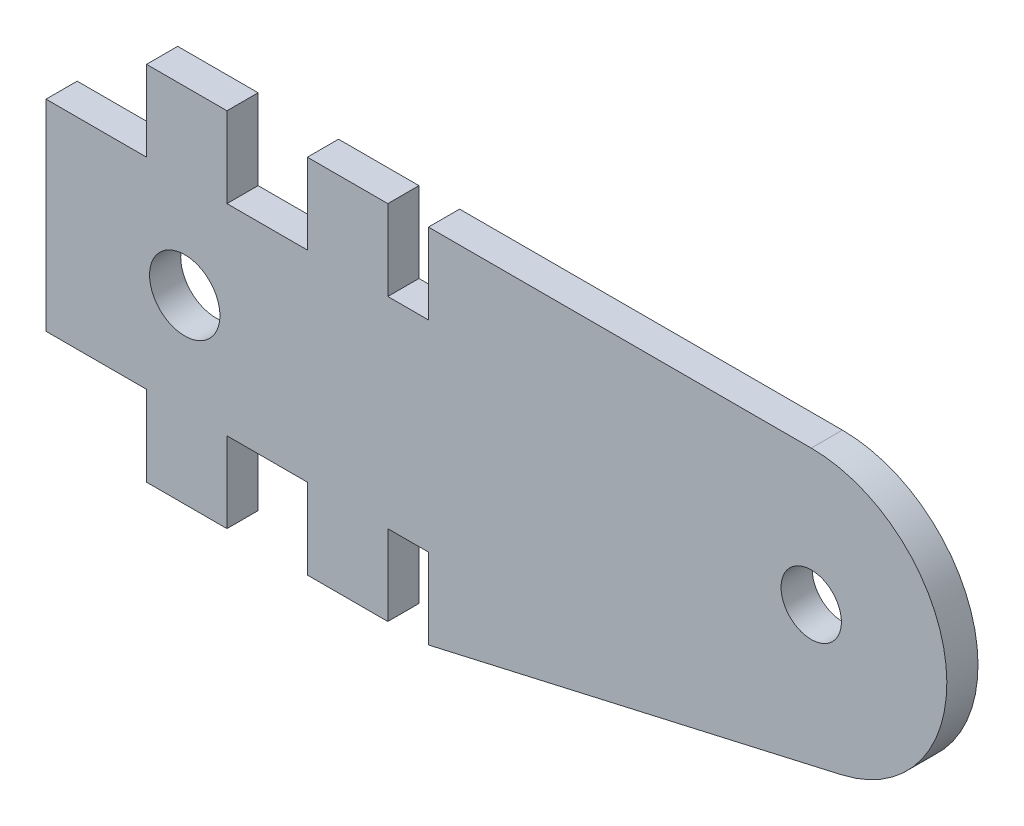
ISO-10303-21;
HEADER;
FILE_DESCRIPTION(('STEP AP214'),'2;1');
FILE_NAME('part.step','',(''),(''),'','','');
FILE_SCHEMA(('AUTOMOTIVE_DESIGN { 1 0 10303 214 1 1 1 1 }'));
ENDSEC;
DATA;
#1=APPLICATION_CONTEXT('core data for automotive mechanical design processes');
#2=APPLICATION_PROTOCOL_DEFINITION('international standard','automotive_design',2000,#1);
#3=PRODUCT_CONTEXT('',#1,'mechanical');
#4=PRODUCT('Part','Part','',(#3));
#5=PRODUCT_RELATED_PRODUCT_CATEGORY('part','',(#4));
#6=PRODUCT_DEFINITION_FORMATION('','',#4);
#7=PRODUCT_DEFINITION_CONTEXT('part definition',#1,'design');
#8=PRODUCT_DEFINITION('design','',#6,#7);
#9=PRODUCT_DEFINITION_SHAPE('','',#8);
#10=(LENGTH_UNIT() NAMED_UNIT(*) SI_UNIT(.MILLI.,.METRE.));
#11=(NAMED_UNIT(*) PLANE_ANGLE_UNIT() SI_UNIT($,.RADIAN.));
#12=(NAMED_UNIT(*) SI_UNIT($,.STERADIAN.) SOLID_ANGLE_UNIT());
#13=UNCERTAINTY_MEASURE_WITH_UNIT(LENGTH_MEASURE(1.E-05),#10,'distance_accuracy_value','');
#14=(GEOMETRIC_REPRESENTATION_CONTEXT(3) GLOBAL_UNCERTAINTY_ASSIGNED_CONTEXT((#13)) GLOBAL_UNIT_ASSIGNED_CONTEXT((#10,
#11,#12)) REPRESENTATION_CONTEXT('',''));
#15=CARTESIAN_POINT('',(0.,0.,0.));
#16=DIRECTION('',(0.,0.,1.));
#17=DIRECTION('',(1.,0.,0.));
#18=AXIS2_PLACEMENT_3D('',#15,#16,#17);
#19=CARTESIAN_POINT('',(38.05949585108,11.2546452739518,1.55));
#20=DIRECTION('',(0.,0.,-1.));
#21=DIRECTION('',(-1.,0.,0.));
#22=AXIS2_PLACEMENT_3D('',#19,#20,#21);
#23=PLANE('',#22);
#24=CARTESIAN_POINT('',(6.9,8.99999999999998,1.55));
#25=DIRECTION('',(0.,0.,1.));
#26=DIRECTION('',(1.,0.,0.));
#27=AXIS2_PLACEMENT_3D('',#24,#25,#26);
#28=CIRCLE('',#27,1.75);
#29=CARTESIAN_POINT('',(5.15,8.99999999999998,1.55));
#30=VERTEX_POINT('',#29);
#31=EDGE_CURVE('E229',#30,#30,#28,.T.);
#32=ORIENTED_EDGE('',*,*,#31,.F.);
#33=EDGE_LOOP('',(#32));
#34=FACE_BOUND('',#33,.T.);
#35=DIRECTION('',(0.,1.,0.));
#36=VECTOR('',#35,1.);
#37=CARTESIAN_POINT('',(9.,0.,1.55));
#38=LINE('',#37,#36);
#39=CARTESIAN_POINT('',(9.,0.,1.55));
#40=VERTEX_POINT('',#39);
#41=CARTESIAN_POINT('',(9.,4.,1.55));
#42=VERTEX_POINT('',#41);
#43=EDGE_CURVE('E272',#40,#42,#38,.T.);
#44=ORIENTED_EDGE('',*,*,#43,.T.);
#45=DIRECTION('',(1.,0.,0.));
#46=VECTOR('',#45,1.);
#47=CARTESIAN_POINT('',(9.,4.,1.55));
#48=LINE('',#47,#46);
#49=CARTESIAN_POINT('',(13.,4.,1.55));
#50=VERTEX_POINT('',#49);
#51=EDGE_CURVE('E140',#42,#50,#48,.T.);
#52=ORIENTED_EDGE('',*,*,#51,.T.);
#53=DIRECTION('',(0.,-1.,0.));
#54=VECTOR('',#53,1.);
#55=CARTESIAN_POINT('',(13.,4.,1.55));
#56=LINE('',#55,#54);
#57=CARTESIAN_POINT('',(13.,0.,1.55));
#58=VERTEX_POINT('',#57);
#59=EDGE_CURVE('E335',#50,#58,#56,.T.);
#60=ORIENTED_EDGE('',*,*,#59,.T.);
#61=DIRECTION('',(1.,0.,0.));
#62=VECTOR('',#61,1.);
#63=CARTESIAN_POINT('',(13.,0.,1.55));
#64=LINE('',#63,#62);
#65=CARTESIAN_POINT('',(17.,0.,1.55));
#66=VERTEX_POINT('',#65);
#67=EDGE_CURVE('E354',#58,#66,#64,.T.);
#68=ORIENTED_EDGE('',*,*,#67,.T.);
#69=DIRECTION('',(0.,1.,0.));
#70=VECTOR('',#69,1.);
#71=CARTESIAN_POINT('',(17.,0.,1.55));
#72=LINE('',#71,#70);
#73=CARTESIAN_POINT('',(17.,4.,1.55));
#74=VERTEX_POINT('',#73);
#75=EDGE_CURVE('E351',#66,#74,#72,.T.);
#76=ORIENTED_EDGE('',*,*,#75,.T.);
#77=DIRECTION('',(1.,0.,0.));
#78=VECTOR('',#77,1.);
#79=CARTESIAN_POINT('',(17.,4.,1.55));
#80=LINE('',#79,#78);
#81=CARTESIAN_POINT('',(19.0215619335038,4.,1.55));
#82=VERTEX_POINT('',#81);
#83=EDGE_CURVE('E353',#74,#82,#80,.T.);
#84=ORIENTED_EDGE('',*,*,#83,.T.);
#85=DIRECTION('',(0.,-1.,0.));
#86=VECTOR('',#85,1.);
#87=CARTESIAN_POINT('',(19.0215619335038,4.,1.55));
#88=LINE('',#87,#86);
#89=CARTESIAN_POINT('',(19.0215619335038,0.,1.55));
#90=VERTEX_POINT('',#89);
#91=EDGE_CURVE('E356',#82,#90,#88,.T.);
#92=ORIENTED_EDGE('',*,*,#91,.T.);
#93=DIRECTION('',(0.97502515916936,0.22209443709099,0.));
#94=VECTOR('',#93,1.);
#95=CARTESIAN_POINT('',(19.0215619335038,0.,1.55));
#96=LINE('',#95,#94);
#97=CARTESIAN_POINT('',(39.5575990260467,4.67776606096354,1.55));
#98=VERTEX_POINT('',#97);
#99=EDGE_CURVE('E362',#90,#98,#96,.T.);
#100=ORIENTED_EDGE('',*,*,#99,.T.);
#101=CARTESIAN_POINT('',(38.05949585108,11.2546452739518,1.55));
#102=DIRECTION('',(0.,0.,1.));
#103=DIRECTION('',(-1.,0.,0.));
#104=AXIS2_PLACEMENT_3D('',#101,#102,#103);
#105=CIRCLE('',#104,6.74534308282997);
#106=CARTESIAN_POINT('',(38.05949585108,17.9999883567818,1.55));
#107=VERTEX_POINT('',#106);
#108=EDGE_CURVE('E364',#98,#107,#105,.T.);
#109=ORIENTED_EDGE('',*,*,#108,.T.);
#110=DIRECTION('',(-1.,0.,0.));
#111=VECTOR('',#110,1.);
#112=CARTESIAN_POINT('',(19.0215619335039,17.9999883567818,1.55));
#113=LINE('',#112,#111);
#114=CARTESIAN_POINT('',(19.0215619335039,17.9999883567818,1.55));
#115=VERTEX_POINT('',#114);
#116=EDGE_CURVE('E366',#107,#115,#113,.T.);
#117=ORIENTED_EDGE('',*,*,#116,.T.);
#118=DIRECTION('',(0.,-1.,0.));
#119=VECTOR('',#118,1.);
#120=CARTESIAN_POINT('',(19.0215619335038,13.9999883567817,1.55));
#121=LINE('',#120,#119);
#122=CARTESIAN_POINT('',(19.0215619335038,13.9999883567817,1.55));
#123=VERTEX_POINT('',#122);
#124=EDGE_CURVE('E368',#115,#123,#121,.T.);
#125=ORIENTED_EDGE('',*,*,#124,.T.);
#126=DIRECTION('',(-1.,0.,0.));
#127=VECTOR('',#126,1.);
#128=CARTESIAN_POINT('',(17.,13.9999883567817,1.55));
#129=LINE('',#128,#127);
#130=CARTESIAN_POINT('',(17.,13.9999883567817,1.55));
#131=VERTEX_POINT('',#130);
#132=EDGE_CURVE('E370',#123,#131,#129,.T.);
#133=ORIENTED_EDGE('',*,*,#132,.T.);
#134=DIRECTION('',(0.,1.,0.));
#135=VECTOR('',#134,1.);
#136=CARTESIAN_POINT('',(17.,17.9999883567817,1.55));
#137=LINE('',#136,#135);
#138=CARTESIAN_POINT('',(17.,17.9999883567817,1.55));
#139=VERTEX_POINT('',#138);
#140=EDGE_CURVE('E372',#131,#139,#137,.T.);
#141=ORIENTED_EDGE('',*,*,#140,.T.);
#142=DIRECTION('',(-1.,0.,0.));
#143=VECTOR('',#142,1.);
#144=CARTESIAN_POINT('',(13.,17.9999883567817,1.55));
#145=LINE('',#144,#143);
#146=CARTESIAN_POINT('',(13.,17.9999883567817,1.55));
#147=VERTEX_POINT('',#146);
#148=EDGE_CURVE('E374',#139,#147,#145,.T.);
#149=ORIENTED_EDGE('',*,*,#148,.T.);
#150=DIRECTION('',(0.,-1.,0.));
#151=VECTOR('',#150,1.);
#152=CARTESIAN_POINT('',(13.,13.9999883567817,1.55));
#153=LINE('',#152,#151);
#154=CARTESIAN_POINT('',(13.,13.9999883567817,1.55));
#155=VERTEX_POINT('',#154);
#156=EDGE_CURVE('E376',#147,#155,#153,.T.);
#157=ORIENTED_EDGE('',*,*,#156,.T.);
#158=DIRECTION('',(-1.,0.,0.));
#159=VECTOR('',#158,1.);
#160=CARTESIAN_POINT('',(9.,13.9999883567817,1.55));
#161=LINE('',#160,#159);
#162=CARTESIAN_POINT('',(9.,13.9999883567817,1.55));
#163=VERTEX_POINT('',#162);
#164=EDGE_CURVE('E378',#155,#163,#161,.T.);
#165=ORIENTED_EDGE('',*,*,#164,.T.);
#166=DIRECTION('',(0.,1.,0.));
#167=VECTOR('',#166,1.);
#168=CARTESIAN_POINT('',(9.,17.9999883567817,1.55));
#169=LINE('',#168,#167);
#170=CARTESIAN_POINT('',(9.,17.9999883567817,1.55));
#171=VERTEX_POINT('',#170);
#172=EDGE_CURVE('E380',#163,#171,#169,.T.);
#173=ORIENTED_EDGE('',*,*,#172,.T.);
#174=DIRECTION('',(-1.,0.,0.));
#175=VECTOR('',#174,1.);
#176=CARTESIAN_POINT('',(5.,17.9999883567817,1.55));
#177=LINE('',#176,#175);
#178=CARTESIAN_POINT('',(5.,17.9999883567817,1.55));
#179=VERTEX_POINT('',#178);
#180=EDGE_CURVE('E382',#171,#179,#177,.T.);
#181=ORIENTED_EDGE('',*,*,#180,.T.);
#182=DIRECTION('',(0.,-1.,0.));
#183=VECTOR('',#182,1.);
#184=CARTESIAN_POINT('',(5.,13.9999883567817,1.55));
#185=LINE('',#184,#183);
#186=CARTESIAN_POINT('',(5.,13.9999883567817,1.55));
#187=VERTEX_POINT('',#186);
#188=EDGE_CURVE('E384',#179,#187,#185,.T.);
#189=ORIENTED_EDGE('',*,*,#188,.T.);
#190=DIRECTION('',(-1.,0.,0.));
#191=VECTOR('',#190,1.);
#192=CARTESIAN_POINT('',(5.,13.9999883567817,1.55));
#193=LINE('',#192,#191);
#194=CARTESIAN_POINT('',(0.,13.9999883567817,1.55));
#195=VERTEX_POINT('',#194);
#196=EDGE_CURVE('E386',#187,#195,#193,.T.);
#197=ORIENTED_EDGE('',*,*,#196,.T.);
#198=DIRECTION('',(0.,-1.,0.));
#199=VECTOR('',#198,1.);
#200=CARTESIAN_POINT('',(0.,13.9999883567817,1.55));
#201=LINE('',#200,#199);
#202=CARTESIAN_POINT('',(0.,4.,1.55));
#203=VERTEX_POINT('',#202);
#204=EDGE_CURVE('E207',#195,#203,#201,.T.);
#205=ORIENTED_EDGE('',*,*,#204,.T.);
#206=DIRECTION('',(1.,0.,0.));
#207=VECTOR('',#206,1.);
#208=CARTESIAN_POINT('',(0.,4.,1.55));
#209=LINE('',#208,#207);
#210=CARTESIAN_POINT('',(5.,4.,1.55));
#211=VERTEX_POINT('',#210);
#212=EDGE_CURVE('E201',#203,#211,#209,.T.);
#213=ORIENTED_EDGE('',*,*,#212,.T.);
#214=DIRECTION('',(0.,-1.,0.));
#215=VECTOR('',#214,1.);
#216=CARTESIAN_POINT('',(5.,4.,1.55));
#217=LINE('',#216,#215);
#218=CARTESIAN_POINT('',(5.,0.,1.55));
#219=VERTEX_POINT('',#218);
#220=EDGE_CURVE('E205',#211,#219,#217,.T.);
#221=ORIENTED_EDGE('',*,*,#220,.T.);
#222=DIRECTION('',(1.,0.,0.));
#223=VECTOR('',#222,1.);
#224=CARTESIAN_POINT('',(5.,0.,1.55));
#225=LINE('',#224,#223);
#226=EDGE_CURVE('E49',#219,#40,#225,.T.);
#227=ORIENTED_EDGE('',*,*,#226,.T.);
#228=EDGE_LOOP('',(#44,#52,#60,#68,#76,#84,#92,#100,#109,#117,#125,#133,#141,#149,#157,#165,
#173,#181,#189,#197,#205,#213,#221,#227));
#229=FACE_BOUND('',#228,.T.);
#230=CARTESIAN_POINT('',(38.05949585108,11.2546452739518,1.55));
#231=DIRECTION('',(0.,0.,1.));
#232=DIRECTION('',(-1.,0.,0.));
#233=AXIS2_PLACEMENT_3D('',#230,#231,#232);
#234=CIRCLE('',#233,1.5);
#235=CARTESIAN_POINT('',(36.55949585108,11.2546452739518,1.55));
#236=VERTEX_POINT('',#235);
#237=EDGE_CURVE('E429',#236,#236,#234,.T.);
#238=ORIENTED_EDGE('',*,*,#237,.F.);
#239=EDGE_LOOP('',(#238));
#240=FACE_BOUND('',#239,.T.);
#241=ADVANCED_FACE('F32',(#34,#229,#240),#23,.F.);
#242=CARTESIAN_POINT('',(38.05949585108,11.2546452739518,0.));
#243=DIRECTION('',(0.,0.,-1.));
#244=DIRECTION('',(-1.,0.,0.));
#245=AXIS2_PLACEMENT_3D('',#242,#243,#244);
#246=PLANE('',#245);
#247=CARTESIAN_POINT('',(6.9,8.99999999999998,0.));
#248=DIRECTION('',(0.,0.,1.));
#249=DIRECTION('',(1.,0.,0.));
#250=AXIS2_PLACEMENT_3D('',#247,#248,#249);
#251=CIRCLE('',#250,1.75);
#252=CARTESIAN_POINT('',(5.15,8.99999999999998,0.));
#253=VERTEX_POINT('',#252);
#254=EDGE_CURVE('E434',#253,#253,#251,.T.);
#255=ORIENTED_EDGE('',*,*,#254,.T.);
#256=EDGE_LOOP('',(#255));
#257=FACE_BOUND('',#256,.T.);
#258=DIRECTION('',(0.,1.,0.));
#259=VECTOR('',#258,1.);
#260=CARTESIAN_POINT('',(9.,0.,0.));
#261=LINE('',#260,#259);
#262=CARTESIAN_POINT('',(9.,0.,0.));
#263=VERTEX_POINT('',#262);
#264=CARTESIAN_POINT('',(9.,4.,0.));
#265=VERTEX_POINT('',#264);
#266=EDGE_CURVE('E225',#263,#265,#261,.T.);
#267=ORIENTED_EDGE('',*,*,#266,.F.);
#268=DIRECTION('',(1.,0.,0.));
#269=VECTOR('',#268,1.);
#270=CARTESIAN_POINT('',(5.,0.,0.));
#271=LINE('',#270,#269);
#272=CARTESIAN_POINT('',(5.,0.,0.));
#273=VERTEX_POINT('',#272);
#274=EDGE_CURVE('E132',#273,#263,#271,.T.);
#275=ORIENTED_EDGE('',*,*,#274,.F.);
#276=DIRECTION('',(0.,-1.,0.));
#277=VECTOR('',#276,1.);
#278=CARTESIAN_POINT('',(5.,4.,0.));
#279=LINE('',#278,#277);
#280=CARTESIAN_POINT('',(5.,4.,0.));
#281=VERTEX_POINT('',#280);
#282=EDGE_CURVE('E126',#281,#273,#279,.T.);
#283=ORIENTED_EDGE('',*,*,#282,.F.);
#284=DIRECTION('',(1.,0.,0.));
#285=VECTOR('',#284,1.);
#286=CARTESIAN_POINT('',(0.,4.,0.));
#287=LINE('',#286,#285);
#288=CARTESIAN_POINT('',(0.,4.,0.));
#289=VERTEX_POINT('',#288);
#290=EDGE_CURVE('E215',#289,#281,#287,.T.);
#291=ORIENTED_EDGE('',*,*,#290,.F.);
#292=DIRECTION('',(0.,-1.,0.));
#293=VECTOR('',#292,1.);
#294=CARTESIAN_POINT('',(0.,13.9999883567817,0.));
#295=LINE('',#294,#293);
#296=CARTESIAN_POINT('',(0.,13.9999883567817,0.));
#297=VERTEX_POINT('',#296);
#298=EDGE_CURVE('E267',#297,#289,#295,.T.);
#299=ORIENTED_EDGE('',*,*,#298,.F.);
#300=DIRECTION('',(-1.,0.,0.));
#301=VECTOR('',#300,1.);
#302=CARTESIAN_POINT('',(5.,13.9999883567817,0.));
#303=LINE('',#302,#301);
#304=CARTESIAN_POINT('',(5.,13.9999883567817,0.));
#305=VERTEX_POINT('',#304);
#306=EDGE_CURVE('E265',#305,#297,#303,.T.);
#307=ORIENTED_EDGE('',*,*,#306,.F.);
#308=DIRECTION('',(0.,-1.,0.));
#309=VECTOR('',#308,1.);
#310=CARTESIAN_POINT('',(5.,13.9999883567817,0.));
#311=LINE('',#310,#309);
#312=CARTESIAN_POINT('',(5.,17.9999883567817,0.));
#313=VERTEX_POINT('',#312);
#314=EDGE_CURVE('E263',#313,#305,#311,.T.);
#315=ORIENTED_EDGE('',*,*,#314,.F.);
#316=DIRECTION('',(-1.,0.,0.));
#317=VECTOR('',#316,1.);
#318=CARTESIAN_POINT('',(5.,17.9999883567817,0.));
#319=LINE('',#318,#317);
#320=CARTESIAN_POINT('',(9.,17.9999883567817,0.));
#321=VERTEX_POINT('',#320);
#322=EDGE_CURVE('E261',#321,#313,#319,.T.);
#323=ORIENTED_EDGE('',*,*,#322,.F.);
#324=DIRECTION('',(0.,1.,0.));
#325=VECTOR('',#324,1.);
#326=CARTESIAN_POINT('',(9.,17.9999883567817,0.));
#327=LINE('',#326,#325);
#328=CARTESIAN_POINT('',(9.,13.9999883567817,0.));
#329=VERTEX_POINT('',#328);
#330=EDGE_CURVE('E259',#329,#321,#327,.T.);
#331=ORIENTED_EDGE('',*,*,#330,.F.);
#332=DIRECTION('',(-1.,0.,0.));
#333=VECTOR('',#332,1.);
#334=CARTESIAN_POINT('',(9.,13.9999883567817,0.));
#335=LINE('',#334,#333);
#336=CARTESIAN_POINT('',(13.,13.9999883567817,0.));
#337=VERTEX_POINT('',#336);
#338=EDGE_CURVE('E257',#337,#329,#335,.T.);
#339=ORIENTED_EDGE('',*,*,#338,.F.);
#340=DIRECTION('',(0.,-1.,0.));
#341=VECTOR('',#340,1.);
#342=CARTESIAN_POINT('',(13.,13.9999883567817,0.));
#343=LINE('',#342,#341);
#344=CARTESIAN_POINT('',(13.,17.9999883567817,0.));
#345=VERTEX_POINT('',#344);
#346=EDGE_CURVE('E255',#345,#337,#343,.T.);
#347=ORIENTED_EDGE('',*,*,#346,.F.);
#348=DIRECTION('',(-1.,0.,0.));
#349=VECTOR('',#348,1.);
#350=CARTESIAN_POINT('',(13.,17.9999883567817,0.));
#351=LINE('',#350,#349);
#352=CARTESIAN_POINT('',(17.,17.9999883567817,0.));
#353=VERTEX_POINT('',#352);
#354=EDGE_CURVE('E253',#353,#345,#351,.T.);
#355=ORIENTED_EDGE('',*,*,#354,.F.);
#356=DIRECTION('',(0.,1.,0.));
#357=VECTOR('',#356,1.);
#358=CARTESIAN_POINT('',(17.,17.9999883567817,0.));
#359=LINE('',#358,#357);
#360=CARTESIAN_POINT('',(17.,13.9999883567817,0.));
#361=VERTEX_POINT('',#360);
#362=EDGE_CURVE('E251',#361,#353,#359,.T.);
#363=ORIENTED_EDGE('',*,*,#362,.F.);
#364=DIRECTION('',(-1.,0.,0.));
#365=VECTOR('',#364,1.);
#366=CARTESIAN_POINT('',(17.,13.9999883567817,0.));
#367=LINE('',#366,#365);
#368=CARTESIAN_POINT('',(19.0215619335038,13.9999883567817,0.));
#369=VERTEX_POINT('',#368);
#370=EDGE_CURVE('E249',#369,#361,#367,.T.);
#371=ORIENTED_EDGE('',*,*,#370,.F.);
#372=DIRECTION('',(0.,-1.,0.));
#373=VECTOR('',#372,1.);
#374=CARTESIAN_POINT('',(19.0215619335038,13.9999883567817,0.));
#375=LINE('',#374,#373);
#376=CARTESIAN_POINT('',(19.0215619335039,17.9999883567818,0.));
#377=VERTEX_POINT('',#376);
#378=EDGE_CURVE('E247',#377,#369,#375,.T.);
#379=ORIENTED_EDGE('',*,*,#378,.F.);
#380=DIRECTION('',(-1.,0.,0.));
#381=VECTOR('',#380,1.);
#382=CARTESIAN_POINT('',(19.0215619335039,17.9999883567818,0.));
#383=LINE('',#382,#381);
#384=CARTESIAN_POINT('',(38.05949585108,17.9999883567818,0.));
#385=VERTEX_POINT('',#384);
#386=EDGE_CURVE('E245',#385,#377,#383,.T.);
#387=ORIENTED_EDGE('',*,*,#386,.F.);
#388=CARTESIAN_POINT('',(38.05949585108,11.2546452739518,0.));
#389=DIRECTION('',(0.,0.,1.));
#390=DIRECTION('',(-1.,0.,0.));
#391=AXIS2_PLACEMENT_3D('',#388,#389,#390);
#392=CIRCLE('',#391,6.74534308282997);
#393=CARTESIAN_POINT('',(39.5575990260467,4.67776606096354,0.));
#394=VERTEX_POINT('',#393);
#395=EDGE_CURVE('E243',#394,#385,#392,.T.);
#396=ORIENTED_EDGE('',*,*,#395,.F.);
#397=DIRECTION('',(0.97502515916936,0.22209443709099,0.));
#398=VECTOR('',#397,1.);
#399=CARTESIAN_POINT('',(19.0215619335038,0.,0.));
#400=LINE('',#399,#398);
#401=CARTESIAN_POINT('',(19.0215619335038,0.,0.));
#402=VERTEX_POINT('',#401);
#403=EDGE_CURVE('E241',#402,#394,#400,.T.);
#404=ORIENTED_EDGE('',*,*,#403,.F.);
#405=DIRECTION('',(0.,-1.,0.));
#406=VECTOR('',#405,1.);
#407=CARTESIAN_POINT('',(19.0215619335038,4.,0.));
#408=LINE('',#407,#406);
#409=CARTESIAN_POINT('',(19.0215619335038,4.,0.));
#410=VERTEX_POINT('',#409);
#411=EDGE_CURVE('E239',#410,#402,#408,.T.);
#412=ORIENTED_EDGE('',*,*,#411,.F.);
#413=DIRECTION('',(1.,0.,0.));
#414=VECTOR('',#413,1.);
#415=CARTESIAN_POINT('',(17.,4.,0.));
#416=LINE('',#415,#414);
#417=CARTESIAN_POINT('',(17.,4.,0.));
#418=VERTEX_POINT('',#417);
#419=EDGE_CURVE('E237',#418,#410,#416,.T.);
#420=ORIENTED_EDGE('',*,*,#419,.F.);
#421=DIRECTION('',(0.,1.,0.));
#422=VECTOR('',#421,1.);
#423=CARTESIAN_POINT('',(17.,0.,0.));
#424=LINE('',#423,#422);
#425=CARTESIAN_POINT('',(17.,0.,0.));
#426=VERTEX_POINT('',#425);
#427=EDGE_CURVE('E235',#426,#418,#424,.T.);
#428=ORIENTED_EDGE('',*,*,#427,.F.);
#429=DIRECTION('',(1.,0.,0.));
#430=VECTOR('',#429,1.);
#431=CARTESIAN_POINT('',(13.,0.,0.));
#432=LINE('',#431,#430);
#433=CARTESIAN_POINT('',(13.,0.,0.));
#434=VERTEX_POINT('',#433);
#435=EDGE_CURVE('E233',#434,#426,#432,.T.);
#436=ORIENTED_EDGE('',*,*,#435,.F.);
#437=DIRECTION('',(0.,-1.,0.));
#438=VECTOR('',#437,1.);
#439=CARTESIAN_POINT('',(13.,4.,0.));
#440=LINE('',#439,#438);
#441=CARTESIAN_POINT('',(13.,4.,0.));
#442=VERTEX_POINT('',#441);
#443=EDGE_CURVE('E231',#442,#434,#440,.T.);
#444=ORIENTED_EDGE('',*,*,#443,.F.);
#445=DIRECTION('',(1.,0.,0.));
#446=VECTOR('',#445,1.);
#447=CARTESIAN_POINT('',(9.,4.,0.));
#448=LINE('',#447,#446);
#449=EDGE_CURVE('E228',#265,#442,#448,.T.);
#450=ORIENTED_EDGE('',*,*,#449,.F.);
#451=EDGE_LOOP('',(#267,#275,#283,#291,#299,#307,#315,#323,#331,#339,#347,#355,#363,#371,#379,
#387,#396,#404,#412,#420,#428,#436,#444,#450));
#452=FACE_BOUND('',#451,.T.);
#453=CARTESIAN_POINT('',(38.05949585108,11.2546452739518,0.));
#454=DIRECTION('',(0.,0.,1.));
#455=DIRECTION('',(-1.,0.,0.));
#456=AXIS2_PLACEMENT_3D('',#453,#454,#455);
#457=CIRCLE('',#456,1.5);
#458=CARTESIAN_POINT('',(36.55949585108,11.2546452739518,0.));
#459=VERTEX_POINT('',#458);
#460=EDGE_CURVE('E432',#459,#459,#457,.T.);
#461=ORIENTED_EDGE('',*,*,#460,.T.);
#462=EDGE_LOOP('',(#461));
#463=FACE_BOUND('',#462,.T.);
#464=ADVANCED_FACE('F339',(#257,#452,#463),#246,.T.);
#465=CARTESIAN_POINT('',(9.,0.,1.55));
#466=DIRECTION('',(-1.,0.,0.));
#467=DIRECTION('',(0.,0.,1.));
#468=AXIS2_PLACEMENT_3D('',#465,#466,#467);
#469=PLANE('',#468);
#470=ORIENTED_EDGE('',*,*,#266,.T.);
#471=DIRECTION('',(0.,0.,-1.));
#472=VECTOR('',#471,1.);
#473=CARTESIAN_POINT('',(9.,4.,1.55));
#474=LINE('',#473,#472);
#475=EDGE_CURVE('E11',#42,#265,#474,.T.);
#476=ORIENTED_EDGE('',*,*,#475,.F.);
#477=ORIENTED_EDGE('',*,*,#43,.F.);
#478=DIRECTION('',(0.,0.,-1.));
#479=VECTOR('',#478,1.);
#480=CARTESIAN_POINT('',(9.,0.,1.55));
#481=LINE('',#480,#479);
#482=EDGE_CURVE('E221',#40,#263,#481,.T.);
#483=ORIENTED_EDGE('',*,*,#482,.T.);
#484=EDGE_LOOP('',(#470,#476,#477,#483));
#485=FACE_BOUND('',#484,.T.);
#486=ADVANCED_FACE('F34',(#485),#469,.F.);
#487=CARTESIAN_POINT('',(9.,4.,1.55));
#488=DIRECTION('',(0.,1.,0.));
#489=DIRECTION('',(0.,0.,1.));
#490=AXIS2_PLACEMENT_3D('',#487,#488,#489);
#491=PLANE('',#490);
#492=ORIENTED_EDGE('',*,*,#449,.T.);
#493=DIRECTION('',(0.,0.,-1.));
#494=VECTOR('',#493,1.);
#495=CARTESIAN_POINT('',(13.,4.,1.55));
#496=LINE('',#495,#494);
#497=EDGE_CURVE('E41',#50,#442,#496,.T.);
#498=ORIENTED_EDGE('',*,*,#497,.F.);
#499=ORIENTED_EDGE('',*,*,#51,.F.);
#500=ORIENTED_EDGE('',*,*,#475,.T.);
#501=EDGE_LOOP('',(#492,#498,#499,#500));
#502=FACE_BOUND('',#501,.T.);
#503=ADVANCED_FACE('F647',(#502),#491,.F.);
#504=CARTESIAN_POINT('',(13.,4.,1.55));
#505=DIRECTION('',(1.,0.,0.));
#506=DIRECTION('',(0.,1.,0.));
#507=AXIS2_PLACEMENT_3D('',#504,#505,#506);
#508=PLANE('',#507);
#509=ORIENTED_EDGE('',*,*,#443,.T.);
#510=DIRECTION('',(0.,0.,-1.));
#511=VECTOR('',#510,1.);
#512=CARTESIAN_POINT('',(13.,0.,1.55));
#513=LINE('',#512,#511);
#514=EDGE_CURVE('E327',#58,#434,#513,.T.);
#515=ORIENTED_EDGE('',*,*,#514,.F.);
#516=ORIENTED_EDGE('',*,*,#59,.F.);
#517=ORIENTED_EDGE('',*,*,#497,.T.);
#518=EDGE_LOOP('',(#509,#515,#516,#517));
#519=FACE_BOUND('',#518,.T.);
#520=ADVANCED_FACE('F333',(#519),#508,.F.);
#521=CARTESIAN_POINT('',(13.,0.,1.55));
#522=DIRECTION('',(0.,1.,0.));
#523=DIRECTION('',(-1.,0.,0.));
#524=AXIS2_PLACEMENT_3D('',#521,#522,#523);
#525=PLANE('',#524);
#526=ORIENTED_EDGE('',*,*,#435,.T.);
#527=DIRECTION('',(0.,0.,-1.));
#528=VECTOR('',#527,1.);
#529=CARTESIAN_POINT('',(17.,0.,1.55));
#530=LINE('',#529,#528);
#531=EDGE_CURVE('E324',#66,#426,#530,.T.);
#532=ORIENTED_EDGE('',*,*,#531,.F.);
#533=ORIENTED_EDGE('',*,*,#67,.F.);
#534=ORIENTED_EDGE('',*,*,#514,.T.);
#535=EDGE_LOOP('',(#526,#532,#533,#534));
#536=FACE_BOUND('',#535,.T.);
#537=ADVANCED_FACE('F345',(#536),#525,.F.);
#538=CARTESIAN_POINT('',(17.,0.,1.55));
#539=DIRECTION('',(-1.,0.,0.));
#540=DIRECTION('',(0.,0.,1.));
#541=AXIS2_PLACEMENT_3D('',#538,#539,#540);
#542=PLANE('',#541);
#543=ORIENTED_EDGE('',*,*,#427,.T.);
#544=DIRECTION('',(0.,0.,-1.));
#545=VECTOR('',#544,1.);
#546=CARTESIAN_POINT('',(17.,4.,1.55));
#547=LINE('',#546,#545);
#548=EDGE_CURVE('E321',#74,#418,#547,.T.);
#549=ORIENTED_EDGE('',*,*,#548,.F.);
#550=ORIENTED_EDGE('',*,*,#75,.F.);
#551=ORIENTED_EDGE('',*,*,#531,.T.);
#552=EDGE_LOOP('',(#543,#549,#550,#551));
#553=FACE_BOUND('',#552,.T.);
#554=ADVANCED_FACE('F349',(#553),#542,.F.);
#555=CARTESIAN_POINT('',(17.,4.,1.55));
#556=DIRECTION('',(0.,1.,0.));
#557=DIRECTION('',(0.,0.,1.));
#558=AXIS2_PLACEMENT_3D('',#555,#556,#557);
#559=PLANE('',#558);
#560=ORIENTED_EDGE('',*,*,#419,.T.);
#561=DIRECTION('',(0.,0.,-1.));
#562=VECTOR('',#561,1.);
#563=CARTESIAN_POINT('',(19.0215619335038,4.,1.55));
#564=LINE('',#563,#562);
#565=EDGE_CURVE('E318',#82,#410,#564,.T.);
#566=ORIENTED_EDGE('',*,*,#565,.F.);
#567=ORIENTED_EDGE('',*,*,#83,.F.);
#568=ORIENTED_EDGE('',*,*,#548,.T.);
#569=EDGE_LOOP('',(#560,#566,#567,#568));
#570=FACE_BOUND('',#569,.T.);
#571=ADVANCED_FACE('F612',(#570),#559,.F.);
#572=CARTESIAN_POINT('',(19.0215619335038,4.,1.55));
#573=DIRECTION('',(1.,0.,0.));
#574=DIRECTION('',(0.,0.,-1.));
#575=AXIS2_PLACEMENT_3D('',#572,#573,#574);
#576=PLANE('',#575);
#577=ORIENTED_EDGE('',*,*,#411,.T.);
#578=DIRECTION('',(0.,0.,-1.));
#579=VECTOR('',#578,1.);
#580=CARTESIAN_POINT('',(19.0215619335038,0.,1.55));
#581=LINE('',#580,#579);
#582=EDGE_CURVE('E315',#90,#402,#581,.T.);
#583=ORIENTED_EDGE('',*,*,#582,.F.);
#584=ORIENTED_EDGE('',*,*,#91,.F.);
#585=ORIENTED_EDGE('',*,*,#565,.T.);
#586=EDGE_LOOP('',(#577,#583,#584,#585));
#587=FACE_BOUND('',#586,.T.);
#588=ADVANCED_FACE('F602',(#587),#576,.F.);
#589=CARTESIAN_POINT('',(19.0215619335038,0.,1.55));
#590=DIRECTION('',(-0.22209443709099,0.97502515916936,0.));
#591=DIRECTION('',(-0.97502515916936,-0.22209443709099,0.));
#592=AXIS2_PLACEMENT_3D('',#589,#590,#591);
#593=PLANE('',#592);
#594=ORIENTED_EDGE('',*,*,#403,.T.);
#595=DIRECTION('',(0.,0.,-1.));
#596=VECTOR('',#595,1.);
#597=CARTESIAN_POINT('',(39.5575990260467,4.67776606096354,1.55));
#598=LINE('',#597,#596);
#599=EDGE_CURVE('E312',#98,#394,#598,.T.);
#600=ORIENTED_EDGE('',*,*,#599,.F.);
#601=ORIENTED_EDGE('',*,*,#99,.F.);
#602=ORIENTED_EDGE('',*,*,#582,.T.);
#603=EDGE_LOOP('',(#594,#600,#601,#602));
#604=FACE_BOUND('',#603,.T.);
#605=ADVANCED_FACE('F592',(#604),#593,.F.);
#606=CARTESIAN_POINT('',(38.05949585108,11.2546452739518,1.55));
#607=DIRECTION('',(0.,0.,-1.));
#608=DIRECTION('',(-1.,0.,0.));
#609=AXIS2_PLACEMENT_3D('',#606,#607,#608);
#610=CYLINDRICAL_SURFACE('',#609,6.74534308282997);
#611=ORIENTED_EDGE('',*,*,#395,.T.);
#612=DIRECTION('',(0.,0.,-1.));
#613=VECTOR('',#612,1.);
#614=CARTESIAN_POINT('',(38.05949585108,17.9999883567818,1.55));
#615=LINE('',#614,#613);
#616=EDGE_CURVE('E309',#107,#385,#615,.T.);
#617=ORIENTED_EDGE('',*,*,#616,.F.);
#618=ORIENTED_EDGE('',*,*,#108,.F.);
#619=ORIENTED_EDGE('',*,*,#599,.T.);
#620=EDGE_LOOP('',(#611,#617,#618,#619));
#621=FACE_BOUND('',#620,.T.);
#622=ADVANCED_FACE('F582',(#621),#610,.T.);
#623=CARTESIAN_POINT('',(19.0215619335039,17.9999883567818,1.55));
#624=DIRECTION('',(0.,-1.,0.));
#625=DIRECTION('',(1.,0.,0.));
#626=AXIS2_PLACEMENT_3D('',#623,#624,#625);
#627=PLANE('',#626);
#628=ORIENTED_EDGE('',*,*,#386,.T.);
#629=DIRECTION('',(0.,0.,-1.));
#630=VECTOR('',#629,1.);
#631=CARTESIAN_POINT('',(19.0215619335039,17.9999883567818,1.55));
#632=LINE('',#631,#630);
#633=EDGE_CURVE('E306',#115,#377,#632,.T.);
#634=ORIENTED_EDGE('',*,*,#633,.F.);
#635=ORIENTED_EDGE('',*,*,#116,.F.);
#636=ORIENTED_EDGE('',*,*,#616,.T.);
#637=EDGE_LOOP('',(#628,#634,#635,#636));
#638=FACE_BOUND('',#637,.T.);
#639=ADVANCED_FACE('F572',(#638),#627,.F.);
#640=CARTESIAN_POINT('',(19.0215619335038,13.9999883567817,1.55));
#641=DIRECTION('',(1.,0.,0.));
#642=DIRECTION('',(0.,1.,0.));
#643=AXIS2_PLACEMENT_3D('',#640,#641,#642);
#644=PLANE('',#643);
#645=ORIENTED_EDGE('',*,*,#378,.T.);
#646=DIRECTION('',(0.,0.,-1.));
#647=VECTOR('',#646,1.);
#648=CARTESIAN_POINT('',(19.0215619335038,13.9999883567817,1.55));
#649=LINE('',#648,#647);
#650=EDGE_CURVE('E303',#123,#369,#649,.T.);
#651=ORIENTED_EDGE('',*,*,#650,.F.);
#652=ORIENTED_EDGE('',*,*,#124,.F.);
#653=ORIENTED_EDGE('',*,*,#633,.T.);
#654=EDGE_LOOP('',(#645,#651,#652,#653));
#655=FACE_BOUND('',#654,.T.);
#656=ADVANCED_FACE('F562',(#655),#644,.F.);
#657=CARTESIAN_POINT('',(17.,13.9999883567817,1.55));
#658=DIRECTION('',(0.,-1.,0.));
#659=DIRECTION('',(0.,0.,-1.));
#660=AXIS2_PLACEMENT_3D('',#657,#658,#659);
#661=PLANE('',#660);
#662=ORIENTED_EDGE('',*,*,#370,.T.);
#663=DIRECTION('',(0.,0.,-1.));
#664=VECTOR('',#663,1.);
#665=CARTESIAN_POINT('',(17.,13.9999883567817,1.55));
#666=LINE('',#665,#664);
#667=EDGE_CURVE('E300',#131,#361,#666,.T.);
#668=ORIENTED_EDGE('',*,*,#667,.F.);
#669=ORIENTED_EDGE('',*,*,#132,.F.);
#670=ORIENTED_EDGE('',*,*,#650,.T.);
#671=EDGE_LOOP('',(#662,#668,#669,#670));
#672=FACE_BOUND('',#671,.T.);
#673=ADVANCED_FACE('F552',(#672),#661,.F.);
#674=CARTESIAN_POINT('',(17.,17.9999883567817,1.55));
#675=DIRECTION('',(-1.,0.,0.));
#676=DIRECTION('',(0.,-1.,0.));
#677=AXIS2_PLACEMENT_3D('',#674,#675,#676);
#678=PLANE('',#677);
#679=ORIENTED_EDGE('',*,*,#362,.T.);
#680=DIRECTION('',(0.,0.,-1.));
#681=VECTOR('',#680,1.);
#682=CARTESIAN_POINT('',(17.,17.9999883567817,1.55));
#683=LINE('',#682,#681);
#684=EDGE_CURVE('E297',#139,#353,#683,.T.);
#685=ORIENTED_EDGE('',*,*,#684,.F.);
#686=ORIENTED_EDGE('',*,*,#140,.F.);
#687=ORIENTED_EDGE('',*,*,#667,.T.);
#688=EDGE_LOOP('',(#679,#685,#686,#687));
#689=FACE_BOUND('',#688,.T.);
#690=ADVANCED_FACE('F542',(#689),#678,.F.);
#691=CARTESIAN_POINT('',(13.,17.9999883567817,1.55));
#692=DIRECTION('',(0.,-1.,0.));
#693=DIRECTION('',(0.,0.,-1.));
#694=AXIS2_PLACEMENT_3D('',#691,#692,#693);
#695=PLANE('',#694);
#696=ORIENTED_EDGE('',*,*,#354,.T.);
#697=DIRECTION('',(0.,0.,-1.));
#698=VECTOR('',#697,1.);
#699=CARTESIAN_POINT('',(13.,17.9999883567817,1.55));
#700=LINE('',#699,#698);
#701=EDGE_CURVE('E294',#147,#345,#700,.T.);
#702=ORIENTED_EDGE('',*,*,#701,.F.);
#703=ORIENTED_EDGE('',*,*,#148,.F.);
#704=ORIENTED_EDGE('',*,*,#684,.T.);
#705=EDGE_LOOP('',(#696,#702,#703,#704));
#706=FACE_BOUND('',#705,.T.);
#707=ADVANCED_FACE('F532',(#706),#695,.F.);
#708=CARTESIAN_POINT('',(13.,13.9999883567817,1.55));
#709=DIRECTION('',(1.,0.,0.));
#710=DIRECTION('',(0.,0.,-1.));
#711=AXIS2_PLACEMENT_3D('',#708,#709,#710);
#712=PLANE('',#711);
#713=ORIENTED_EDGE('',*,*,#346,.T.);
#714=DIRECTION('',(0.,0.,-1.));
#715=VECTOR('',#714,1.);
#716=CARTESIAN_POINT('',(13.,13.9999883567817,1.55));
#717=LINE('',#716,#715);
#718=EDGE_CURVE('E291',#155,#337,#717,.T.);
#719=ORIENTED_EDGE('',*,*,#718,.F.);
#720=ORIENTED_EDGE('',*,*,#156,.F.);
#721=ORIENTED_EDGE('',*,*,#701,.T.);
#722=EDGE_LOOP('',(#713,#719,#720,#721));
#723=FACE_BOUND('',#722,.T.);
#724=ADVANCED_FACE('F522',(#723),#712,.F.);
#725=CARTESIAN_POINT('',(9.,13.9999883567817,1.55));
#726=DIRECTION('',(0.,-1.,0.));
#727=DIRECTION('',(0.,0.,-1.));
#728=AXIS2_PLACEMENT_3D('',#725,#726,#727);
#729=PLANE('',#728);
#730=ORIENTED_EDGE('',*,*,#338,.T.);
#731=DIRECTION('',(0.,0.,-1.));
#732=VECTOR('',#731,1.);
#733=CARTESIAN_POINT('',(9.,13.9999883567817,1.55));
#734=LINE('',#733,#732);
#735=EDGE_CURVE('E288',#163,#329,#734,.T.);
#736=ORIENTED_EDGE('',*,*,#735,.F.);
#737=ORIENTED_EDGE('',*,*,#164,.F.);
#738=ORIENTED_EDGE('',*,*,#718,.T.);
#739=EDGE_LOOP('',(#730,#736,#737,#738));
#740=FACE_BOUND('',#739,.T.);
#741=ADVANCED_FACE('F512',(#740),#729,.F.);
#742=CARTESIAN_POINT('',(9.,17.9999883567817,1.55));
#743=DIRECTION('',(-1.,0.,0.));
#744=DIRECTION('',(0.,0.,1.));
#745=AXIS2_PLACEMENT_3D('',#742,#743,#744);
#746=PLANE('',#745);
#747=ORIENTED_EDGE('',*,*,#330,.T.);
#748=DIRECTION('',(0.,0.,-1.));
#749=VECTOR('',#748,1.);
#750=CARTESIAN_POINT('',(9.,17.9999883567817,1.55));
#751=LINE('',#750,#749);
#752=EDGE_CURVE('E285',#171,#321,#751,.T.);
#753=ORIENTED_EDGE('',*,*,#752,.F.);
#754=ORIENTED_EDGE('',*,*,#172,.F.);
#755=ORIENTED_EDGE('',*,*,#735,.T.);
#756=EDGE_LOOP('',(#747,#753,#754,#755));
#757=FACE_BOUND('',#756,.T.);
#758=ADVANCED_FACE('F502',(#757),#746,.F.);
#759=CARTESIAN_POINT('',(5.,17.9999883567817,1.55));
#760=DIRECTION('',(0.,-1.,0.));
#761=DIRECTION('',(0.,0.,-1.));
#762=AXIS2_PLACEMENT_3D('',#759,#760,#761);
#763=PLANE('',#762);
#764=ORIENTED_EDGE('',*,*,#322,.T.);
#765=DIRECTION('',(0.,0.,-1.));
#766=VECTOR('',#765,1.);
#767=CARTESIAN_POINT('',(5.,17.9999883567817,1.55));
#768=LINE('',#767,#766);
#769=EDGE_CURVE('E282',#179,#313,#768,.T.);
#770=ORIENTED_EDGE('',*,*,#769,.F.);
#771=ORIENTED_EDGE('',*,*,#180,.F.);
#772=ORIENTED_EDGE('',*,*,#752,.T.);
#773=EDGE_LOOP('',(#764,#770,#771,#772));
#774=FACE_BOUND('',#773,.T.);
#775=ADVANCED_FACE('F492',(#774),#763,.F.);
#776=CARTESIAN_POINT('',(5.,13.9999883567817,1.55));
#777=DIRECTION('',(1.,0.,0.));
#778=DIRECTION('',(0.,0.,-1.));
#779=AXIS2_PLACEMENT_3D('',#776,#777,#778);
#780=PLANE('',#779);
#781=ORIENTED_EDGE('',*,*,#314,.T.);
#782=DIRECTION('',(0.,0.,-1.));
#783=VECTOR('',#782,1.);
#784=CARTESIAN_POINT('',(5.,13.9999883567817,1.55));
#785=LINE('',#784,#783);
#786=EDGE_CURVE('E279',#187,#305,#785,.T.);
#787=ORIENTED_EDGE('',*,*,#786,.F.);
#788=ORIENTED_EDGE('',*,*,#188,.F.);
#789=ORIENTED_EDGE('',*,*,#769,.T.);
#790=EDGE_LOOP('',(#781,#787,#788,#789));
#791=FACE_BOUND('',#790,.T.);
#792=ADVANCED_FACE('F483',(#791),#780,.F.);
#793=CARTESIAN_POINT('',(5.,13.9999883567817,1.55));
#794=DIRECTION('',(0.,-1.,0.));
#795=DIRECTION('',(0.,0.,-1.));
#796=AXIS2_PLACEMENT_3D('',#793,#794,#795);
#797=PLANE('',#796);
#798=ORIENTED_EDGE('',*,*,#306,.T.);
#799=DIRECTION('',(0.,0.,-1.));
#800=VECTOR('',#799,1.);
#801=CARTESIAN_POINT('',(0.,13.9999883567817,1.55));
#802=LINE('',#801,#800);
#803=EDGE_CURVE('E276',#195,#297,#802,.T.);
#804=ORIENTED_EDGE('',*,*,#803,.F.);
#805=ORIENTED_EDGE('',*,*,#196,.F.);
#806=ORIENTED_EDGE('',*,*,#786,.T.);
#807=EDGE_LOOP('',(#798,#804,#805,#806));
#808=FACE_BOUND('',#807,.T.);
#809=ADVANCED_FACE('F392',(#808),#797,.F.);
#810=CARTESIAN_POINT('',(0.,13.9999883567817,1.55));
#811=DIRECTION('',(1.,0.,0.));
#812=DIRECTION('',(0.,1.,0.));
#813=AXIS2_PLACEMENT_3D('',#810,#811,#812);
#814=PLANE('',#813);
#815=ORIENTED_EDGE('',*,*,#298,.T.);
#816=DIRECTION('',(0.,0.,-1.));
#817=VECTOR('',#816,1.);
#818=CARTESIAN_POINT('',(0.,4.,1.55));
#819=LINE('',#818,#817);
#820=EDGE_CURVE('E216',#203,#289,#819,.T.);
#821=ORIENTED_EDGE('',*,*,#820,.F.);
#822=ORIENTED_EDGE('',*,*,#204,.F.);
#823=ORIENTED_EDGE('',*,*,#803,.T.);
#824=EDGE_LOOP('',(#815,#821,#822,#823));
#825=FACE_BOUND('',#824,.T.);
#826=ADVANCED_FACE('F396',(#825),#814,.F.);
#827=CARTESIAN_POINT('',(0.,4.,1.55));
#828=DIRECTION('',(0.,1.,0.));
#829=DIRECTION('',(0.,0.,1.));
#830=AXIS2_PLACEMENT_3D('',#827,#828,#829);
#831=PLANE('',#830);
#832=ORIENTED_EDGE('',*,*,#290,.T.);
#833=DIRECTION('',(0.,0.,-1.));
#834=VECTOR('',#833,1.);
#835=CARTESIAN_POINT('',(5.,4.,1.55));
#836=LINE('',#835,#834);
#837=EDGE_CURVE('E212',#211,#281,#836,.T.);
#838=ORIENTED_EDGE('',*,*,#837,.F.);
#839=ORIENTED_EDGE('',*,*,#212,.F.);
#840=ORIENTED_EDGE('',*,*,#820,.T.);
#841=EDGE_LOOP('',(#832,#838,#839,#840));
#842=FACE_BOUND('',#841,.T.);
#843=ADVANCED_FACE('F213',(#842),#831,.F.);
#844=CARTESIAN_POINT('',(5.,4.,1.55));
#845=DIRECTION('',(1.,0.,0.));
#846=DIRECTION('',(0.,0.,-1.));
#847=AXIS2_PLACEMENT_3D('',#844,#845,#846);
#848=PLANE('',#847);
#849=ORIENTED_EDGE('',*,*,#282,.T.);
#850=DIRECTION('',(0.,0.,-1.));
#851=VECTOR('',#850,1.);
#852=CARTESIAN_POINT('',(5.,0.,1.55));
#853=LINE('',#852,#851);
#854=EDGE_CURVE('E217',#219,#273,#853,.T.);
#855=ORIENTED_EDGE('',*,*,#854,.F.);
#856=ORIENTED_EDGE('',*,*,#220,.F.);
#857=ORIENTED_EDGE('',*,*,#837,.T.);
#858=EDGE_LOOP('',(#849,#855,#856,#857));
#859=FACE_BOUND('',#858,.T.);
#860=ADVANCED_FACE('F219',(#859),#848,.F.);
#861=CARTESIAN_POINT('',(5.,0.,1.55));
#862=DIRECTION('',(0.,1.,0.));
#863=DIRECTION('',(0.,0.,1.));
#864=AXIS2_PLACEMENT_3D('',#861,#862,#863);
#865=PLANE('',#864);
#866=ORIENTED_EDGE('',*,*,#274,.T.);
#867=ORIENTED_EDGE('',*,*,#482,.F.);
#868=ORIENTED_EDGE('',*,*,#226,.F.);
#869=ORIENTED_EDGE('',*,*,#854,.T.);
#870=EDGE_LOOP('',(#866,#867,#868,#869));
#871=FACE_BOUND('',#870,.T.);
#872=ADVANCED_FACE('F400',(#871),#865,.F.);
#873=CARTESIAN_POINT('',(6.9,8.99999999999998,1.55));
#874=DIRECTION('',(0.,0.,-1.));
#875=DIRECTION('',(-1.,0.,0.));
#876=AXIS2_PLACEMENT_3D('',#873,#874,#875);
#877=CYLINDRICAL_SURFACE('',#876,1.75);
#878=CARTESIAN_POINT('',(5.15,8.99999999999998,1.55));
#879=CARTESIAN_POINT('',(5.15,8.99999999999998,1.53385416666667));
#880=CARTESIAN_POINT('',(5.15,8.99999999999998,1.51770833333333));
#881=CARTESIAN_POINT('',(5.15,8.99999999999998,1.48541666666667));
#882=CARTESIAN_POINT('',(5.15,8.99999999999998,1.46927083333333));
#883=CARTESIAN_POINT('',(5.15,8.99999999999998,1.43697916666667));
#884=CARTESIAN_POINT('',(5.15,8.99999999999998,1.42083333333333));
#885=CARTESIAN_POINT('',(5.15,8.99999999999998,1.38854166666667));
#886=CARTESIAN_POINT('',(5.15,8.99999999999998,1.37239583333333));
#887=CARTESIAN_POINT('',(5.15,8.99999999999998,1.34010416666667));
#888=CARTESIAN_POINT('',(5.15,8.99999999999998,1.32395833333333));
#889=CARTESIAN_POINT('',(5.15,8.99999999999998,1.29166666666667));
#890=CARTESIAN_POINT('',(5.15,8.99999999999998,1.27552083333333));
#891=CARTESIAN_POINT('',(5.15,8.99999999999998,1.24322916666667));
#892=CARTESIAN_POINT('',(5.15,8.99999999999998,1.22708333333333));
#893=CARTESIAN_POINT('',(5.15,8.99999999999998,1.19479166666667));
#894=CARTESIAN_POINT('',(5.15,8.99999999999998,1.17864583333333));
#895=CARTESIAN_POINT('',(5.15,8.99999999999998,1.14635416666667));
#896=CARTESIAN_POINT('',(5.15,8.99999999999998,1.13020833333333));
#897=CARTESIAN_POINT('',(5.15,8.99999999999998,1.09791666666667));
#898=CARTESIAN_POINT('',(5.15,8.99999999999998,1.08177083333333));
#899=CARTESIAN_POINT('',(5.15,8.99999999999998,1.04947916666667));
#900=CARTESIAN_POINT('',(5.15,8.99999999999998,1.03333333333333));
#901=CARTESIAN_POINT('',(5.15,8.99999999999998,1.00104166666667));
#902=CARTESIAN_POINT('',(5.15,8.99999999999998,0.984895833333333));
#903=CARTESIAN_POINT('',(5.15,8.99999999999998,0.952604166666667));
#904=CARTESIAN_POINT('',(5.15,8.99999999999998,0.936458333333333));
#905=CARTESIAN_POINT('',(5.15,8.99999999999998,0.904166666666667));
#906=CARTESIAN_POINT('',(5.15,8.99999999999998,0.888020833333333));
#907=CARTESIAN_POINT('',(5.15,8.99999999999998,0.855729166666667));
#908=CARTESIAN_POINT('',(5.15,8.99999999999998,0.839583333333333));
#909=CARTESIAN_POINT('',(5.15,8.99999999999998,0.807291666666667));
#910=CARTESIAN_POINT('',(5.15,8.99999999999998,0.791145833333333));
#911=CARTESIAN_POINT('',(5.15,8.99999999999998,0.758854166666667));
#912=CARTESIAN_POINT('',(5.15,8.99999999999998,0.742708333333333));
#913=CARTESIAN_POINT('',(5.15,8.99999999999998,0.710416666666667));
#914=CARTESIAN_POINT('',(5.15,8.99999999999998,0.694270833333333));
#915=CARTESIAN_POINT('',(5.15,8.99999999999998,0.661979166666667));
#916=CARTESIAN_POINT('',(5.15,8.99999999999998,0.645833333333333));
#917=CARTESIAN_POINT('',(5.15,8.99999999999998,0.613541666666667));
#918=CARTESIAN_POINT('',(5.15,8.99999999999998,0.597395833333333));
#919=CARTESIAN_POINT('',(5.15,8.99999999999998,0.565104166666667));
#920=CARTESIAN_POINT('',(5.15,8.99999999999998,0.548958333333333));
#921=CARTESIAN_POINT('',(5.15,8.99999999999998,0.516666666666667));
#922=CARTESIAN_POINT('',(5.15,8.99999999999998,0.500520833333333));
#923=CARTESIAN_POINT('',(5.15,8.99999999999998,0.468229166666667));
#924=CARTESIAN_POINT('',(5.15,8.99999999999998,0.452083333333333));
#925=CARTESIAN_POINT('',(5.15,8.99999999999998,0.419791666666667));
#926=CARTESIAN_POINT('',(5.15,8.99999999999998,0.403645833333333));
#927=CARTESIAN_POINT('',(5.15,8.99999999999998,0.371354166666667));
#928=CARTESIAN_POINT('',(5.15,8.99999999999998,0.355208333333333));
#929=CARTESIAN_POINT('',(5.15,8.99999999999998,0.322916666666667));
#930=CARTESIAN_POINT('',(5.15,8.99999999999998,0.306770833333333));
#931=CARTESIAN_POINT('',(5.15,8.99999999999998,0.274479166666667));
#932=CARTESIAN_POINT('',(5.15,8.99999999999998,0.258333333333333));
#933=CARTESIAN_POINT('',(5.15,8.99999999999998,0.226041666666667));
#934=CARTESIAN_POINT('',(5.15,8.99999999999998,0.209895833333333));
#935=CARTESIAN_POINT('',(5.15,8.99999999999998,0.177604166666667));
#936=CARTESIAN_POINT('',(5.15,8.99999999999998,0.161458333333333));
#937=CARTESIAN_POINT('',(5.15,8.99999999999998,0.129166666666667));
#938=CARTESIAN_POINT('',(5.15,8.99999999999998,0.113020833333333));
#939=CARTESIAN_POINT('',(5.15,8.99999999999998,0.0807291666666667));
#940=CARTESIAN_POINT('',(5.15,8.99999999999998,0.0645833333333334));
#941=CARTESIAN_POINT('',(5.15,8.99999999999998,0.0322916666666667));
#942=CARTESIAN_POINT('',(5.15,8.99999999999998,0.0161458333333334));
#943=CARTESIAN_POINT('',(5.15,8.99999999999998,0.));
#944=B_SPLINE_CURVE_WITH_KNOTS('',3,(#878,#879,#880,#881,#882,#883,#884,#885,#886,#887,#888,
#889,#890,#891,#892,#893,#894,#895,#896,#897,#898,#899,#900,#901,#902,#903,#904,#905,#906,#907,
#908,#909,#910,#911,#912,#913,#914,#915,#916,#917,#918,#919,#920,#921,#922,#923,#924,#925,#926,
#927,#928,#929,#930,#931,#932,#933,#934,#935,#936,#937,#938,#939,#940,#941,#942,#943),
.UNSPECIFIED.,.F.,.F.,(4,2,2,2,2,2,2,2,2,2,2,2,2,2,2,2,2,2,2,2,2,2,2,2,2,2,2,2,2,2,2,2,4),(0.,
0.0484375000000001,0.0968750000000002,0.1453125,0.19375,0.2421875,0.290625,0.3390625,0.3875,
0.4359375,0.484375,0.5328125,0.58125,0.6296875,0.678125,0.7265625,0.775,0.8234375,0.871875,
0.9203125,0.96875,1.0171875,1.065625,1.1140625,1.1625,1.2109375,1.259375,1.3078125,1.35625,
1.4046875,1.453125,1.5015625,1.55),.UNSPECIFIED.);
#945=EDGE_CURVE('BSEAM402',#30,#253,#944,.T.);
#946=ORIENTED_EDGE('',*,*,#31,.T.);
#947=ORIENTED_EDGE('',*,*,#254,.F.);
#948=ORIENTED_EDGE('',*,*,#945,.T.);
#949=ORIENTED_EDGE('',*,*,#945,.F.);
#950=EDGE_LOOP('',(#946,#948,#947,#949));
#951=FACE_BOUND('',#950,.T.);
#952=ADVANCED_FACE('F402',(#951),#877,.F.);
#953=CARTESIAN_POINT('',(38.05949585108,11.2546452739518,1.55));
#954=DIRECTION('',(0.,0.,-1.));
#955=DIRECTION('',(-1.,0.,0.));
#956=AXIS2_PLACEMENT_3D('',#953,#954,#955);
#957=CYLINDRICAL_SURFACE('',#956,1.5);
#958=CARTESIAN_POINT('',(36.55949585108,11.2546452739518,1.55));
#959=CARTESIAN_POINT('',(36.55949585108,11.2546452739518,1.53385416666667));
#960=CARTESIAN_POINT('',(36.55949585108,11.2546452739518,1.51770833333333));
#961=CARTESIAN_POINT('',(36.55949585108,11.2546452739518,1.48541666666667));
#962=CARTESIAN_POINT('',(36.55949585108,11.2546452739518,1.46927083333333));
#963=CARTESIAN_POINT('',(36.55949585108,11.2546452739518,1.43697916666667));
#964=CARTESIAN_POINT('',(36.55949585108,11.2546452739518,1.42083333333333));
#965=CARTESIAN_POINT('',(36.55949585108,11.2546452739518,1.38854166666667));
#966=CARTESIAN_POINT('',(36.55949585108,11.2546452739518,1.37239583333333));
#967=CARTESIAN_POINT('',(36.55949585108,11.2546452739518,1.34010416666667));
#968=CARTESIAN_POINT('',(36.55949585108,11.2546452739518,1.32395833333333));
#969=CARTESIAN_POINT('',(36.55949585108,11.2546452739518,1.29166666666667));
#970=CARTESIAN_POINT('',(36.55949585108,11.2546452739518,1.27552083333333));
#971=CARTESIAN_POINT('',(36.55949585108,11.2546452739518,1.24322916666667));
#972=CARTESIAN_POINT('',(36.55949585108,11.2546452739518,1.22708333333333));
#973=CARTESIAN_POINT('',(36.55949585108,11.2546452739518,1.19479166666667));
#974=CARTESIAN_POINT('',(36.55949585108,11.2546452739518,1.17864583333333));
#975=CARTESIAN_POINT('',(36.55949585108,11.2546452739518,1.14635416666667));
#976=CARTESIAN_POINT('',(36.55949585108,11.2546452739518,1.13020833333333));
#977=CARTESIAN_POINT('',(36.55949585108,11.2546452739518,1.09791666666667));
#978=CARTESIAN_POINT('',(36.55949585108,11.2546452739518,1.08177083333333));
#979=CARTESIAN_POINT('',(36.55949585108,11.2546452739518,1.04947916666667));
#980=CARTESIAN_POINT('',(36.55949585108,11.2546452739518,1.03333333333333));
#981=CARTESIAN_POINT('',(36.55949585108,11.2546452739518,1.00104166666667));
#982=CARTESIAN_POINT('',(36.55949585108,11.2546452739518,0.984895833333333));
#983=CARTESIAN_POINT('',(36.55949585108,11.2546452739518,0.952604166666667));
#984=CARTESIAN_POINT('',(36.55949585108,11.2546452739518,0.936458333333333));
#985=CARTESIAN_POINT('',(36.55949585108,11.2546452739518,0.904166666666667));
#986=CARTESIAN_POINT('',(36.55949585108,11.2546452739518,0.888020833333333));
#987=CARTESIAN_POINT('',(36.55949585108,11.2546452739518,0.855729166666667));
#988=CARTESIAN_POINT('',(36.55949585108,11.2546452739518,0.839583333333333));
#989=CARTESIAN_POINT('',(36.55949585108,11.2546452739518,0.807291666666667));
#990=CARTESIAN_POINT('',(36.55949585108,11.2546452739518,0.791145833333333));
#991=CARTESIAN_POINT('',(36.55949585108,11.2546452739518,0.758854166666667));
#992=CARTESIAN_POINT('',(36.55949585108,11.2546452739518,0.742708333333333));
#993=CARTESIAN_POINT('',(36.55949585108,11.2546452739518,0.710416666666667));
#994=CARTESIAN_POINT('',(36.55949585108,11.2546452739518,0.694270833333333));
#995=CARTESIAN_POINT('',(36.55949585108,11.2546452739518,0.661979166666667));
#996=CARTESIAN_POINT('',(36.55949585108,11.2546452739518,0.645833333333333));
#997=CARTESIAN_POINT('',(36.55949585108,11.2546452739518,0.613541666666667));
#998=CARTESIAN_POINT('',(36.55949585108,11.2546452739518,0.597395833333333));
#999=CARTESIAN_POINT('',(36.55949585108,11.2546452739518,0.565104166666667));
#1000=CARTESIAN_POINT('',(36.55949585108,11.2546452739518,0.548958333333333));
#1001=CARTESIAN_POINT('',(36.55949585108,11.2546452739518,0.516666666666667));
#1002=CARTESIAN_POINT('',(36.55949585108,11.2546452739518,0.500520833333333));
#1003=CARTESIAN_POINT('',(36.55949585108,11.2546452739518,0.468229166666667));
#1004=CARTESIAN_POINT('',(36.55949585108,11.2546452739518,0.452083333333333));
#1005=CARTESIAN_POINT('',(36.55949585108,11.2546452739518,0.419791666666667));
#1006=CARTESIAN_POINT('',(36.55949585108,11.2546452739518,0.403645833333333));
#1007=CARTESIAN_POINT('',(36.55949585108,11.2546452739518,0.371354166666667));
#1008=CARTESIAN_POINT('',(36.55949585108,11.2546452739518,0.355208333333333));
#1009=CARTESIAN_POINT('',(36.55949585108,11.2546452739518,0.322916666666667));
#1010=CARTESIAN_POINT('',(36.55949585108,11.2546452739518,0.306770833333333));
#1011=CARTESIAN_POINT('',(36.55949585108,11.2546452739518,0.274479166666667));
#1012=CARTESIAN_POINT('',(36.55949585108,11.2546452739518,0.258333333333333));
#1013=CARTESIAN_POINT('',(36.55949585108,11.2546452739518,0.226041666666667));
#1014=CARTESIAN_POINT('',(36.55949585108,11.2546452739518,0.209895833333333));
#1015=CARTESIAN_POINT('',(36.55949585108,11.2546452739518,0.177604166666667));
#1016=CARTESIAN_POINT('',(36.55949585108,11.2546452739518,0.161458333333333));
#1017=CARTESIAN_POINT('',(36.55949585108,11.2546452739518,0.129166666666667));
#1018=CARTESIAN_POINT('',(36.55949585108,11.2546452739518,0.113020833333333));
#1019=CARTESIAN_POINT('',(36.55949585108,11.2546452739518,0.0807291666666667));
#1020=CARTESIAN_POINT('',(36.55949585108,11.2546452739518,0.0645833333333334));
#1021=CARTESIAN_POINT('',(36.55949585108,11.2546452739518,0.0322916666666667));
#1022=CARTESIAN_POINT('',(36.55949585108,11.2546452739518,0.0161458333333334));
#1023=CARTESIAN_POINT('',(36.55949585108,11.2546452739518,0.));
#1024=B_SPLINE_CURVE_WITH_KNOTS('',3,(#958,#959,#960,#961,#962,#963,#964,#965,#966,#967,#968,
#969,#970,#971,#972,#973,#974,#975,#976,#977,#978,#979,#980,#981,#982,#983,#984,#985,#986,#987,
#988,#989,#990,#991,#992,#993,#994,#995,#996,#997,#998,#999,#1000,#1001,#1002,#1003,#1004,#1005,
#1006,#1007,#1008,#1009,#1010,#1011,#1012,#1013,#1014,#1015,#1016,#1017,#1018,#1019,#1020,#1021,
#1022,#1023),.UNSPECIFIED.,.F.,.F.,(4,2,2,2,2,2,2,2,2,2,2,2,2,2,2,2,2,2,2,2,2,2,2,2,2,2,2,2,2,2,
2,2,4),(0.,0.0484374999999999,0.096875,0.1453125,0.19375,0.2421875,0.290625,0.3390625,0.3875,
0.4359375,0.484375,0.5328125,0.58125,0.6296875,0.678125,0.7265625,0.775,0.8234375,0.871875,
0.9203125,0.96875,1.0171875,1.065625,1.1140625,1.1625,1.2109375,1.259375,1.3078125,1.35625,
1.4046875,1.453125,1.5015625,1.55),.UNSPECIFIED.);
#1025=EDGE_CURVE('BSEAM408',#236,#459,#1024,.T.);
#1026=ORIENTED_EDGE('',*,*,#237,.T.);
#1027=ORIENTED_EDGE('',*,*,#460,.F.);
#1028=ORIENTED_EDGE('',*,*,#1025,.T.);
#1029=ORIENTED_EDGE('',*,*,#1025,.F.);
#1030=EDGE_LOOP('',(#1026,#1028,#1027,#1029));
#1031=FACE_BOUND('',#1030,.T.);
#1032=ADVANCED_FACE('F408',(#1031),#957,.F.);
#1033=CLOSED_SHELL('',(#241,#464,#486,#503,#520,#537,#554,#571,#588,#605,#622,#639,#656,#673,
#690,#707,#724,#741,#758,#775,#792,#809,#826,#843,#860,#872,#952,#1032));
#1034=MANIFOLD_SOLID_BREP('B2',#1033);
#1035=ADVANCED_BREP_SHAPE_REPRESENTATION('',(#18,#1034),#14);
#1036=SHAPE_DEFINITION_REPRESENTATION(#9,#1035);
ENDSEC;
END-ISO-10303-21;
